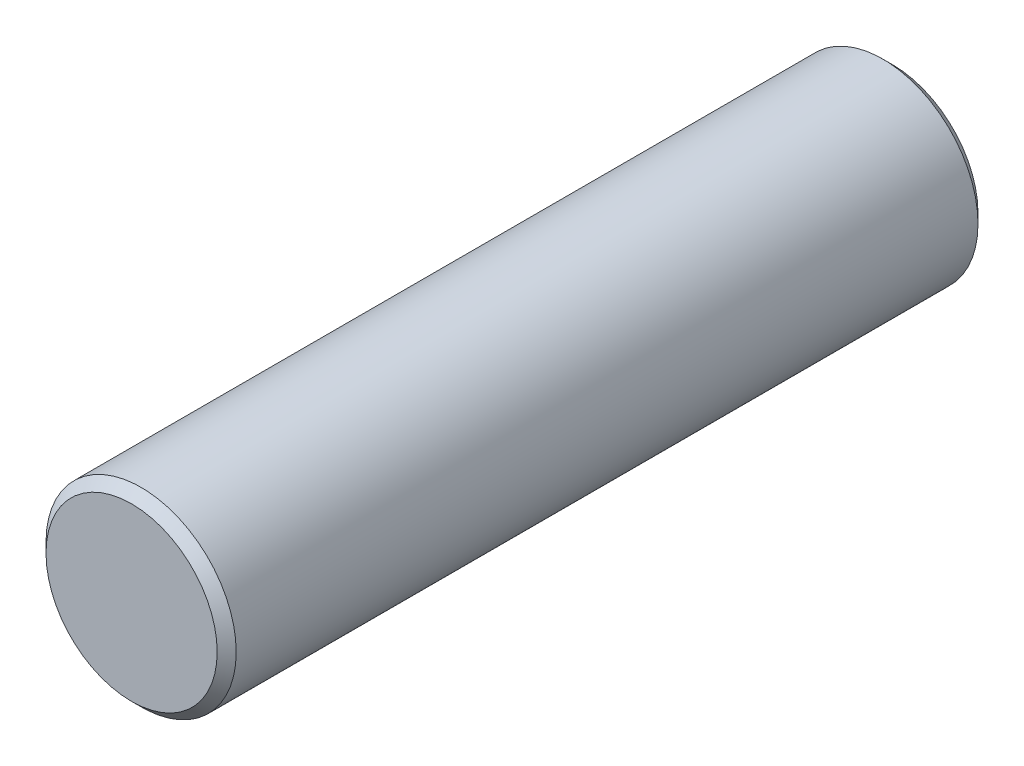
ISO-10303-21;
HEADER;
FILE_DESCRIPTION(('STEP AP214'),'2;1');
FILE_NAME('part.step','',(''),(''),'','','');
FILE_SCHEMA(('AUTOMOTIVE_DESIGN { 1 0 10303 214 1 1 1 1 }'));
ENDSEC;
DATA;
#1=APPLICATION_CONTEXT('core data for automotive mechanical design processes');
#2=APPLICATION_PROTOCOL_DEFINITION('international standard','automotive_design',2000,#1);
#3=PRODUCT_CONTEXT('',#1,'mechanical');
#4=PRODUCT('Part','Part','',(#3));
#5=PRODUCT_RELATED_PRODUCT_CATEGORY('part','',(#4));
#6=PRODUCT_DEFINITION_FORMATION('','',#4);
#7=PRODUCT_DEFINITION_CONTEXT('part definition',#1,'design');
#8=PRODUCT_DEFINITION('design','',#6,#7);
#9=PRODUCT_DEFINITION_SHAPE('','',#8);
#10=(LENGTH_UNIT() NAMED_UNIT(*) SI_UNIT(.MILLI.,.METRE.));
#11=(NAMED_UNIT(*) PLANE_ANGLE_UNIT() SI_UNIT($,.RADIAN.));
#12=(NAMED_UNIT(*) SI_UNIT($,.STERADIAN.) SOLID_ANGLE_UNIT());
#13=UNCERTAINTY_MEASURE_WITH_UNIT(LENGTH_MEASURE(1.E-05),#10,'distance_accuracy_value','');
#14=(GEOMETRIC_REPRESENTATION_CONTEXT(3) GLOBAL_UNCERTAINTY_ASSIGNED_CONTEXT((#13)) GLOBAL_UNIT_ASSIGNED_CONTEXT((#10,
#11,#12)) REPRESENTATION_CONTEXT('',''));
#15=CARTESIAN_POINT('',(0.,0.,0.));
#16=DIRECTION('',(0.,0.,1.));
#17=DIRECTION('',(1.,0.,0.));
#18=AXIS2_PLACEMENT_3D('',#15,#16,#17);
#19=CARTESIAN_POINT('',(0.,0.,40.));
#20=DIRECTION('',(0.,0.,-1.));
#21=DIRECTION('',(-1.00000000000003,0.,0.));
#22=AXIS2_PLACEMENT_3D('',#19,#20,#21);
#23=CYLINDRICAL_SURFACE('',#22,5.);
#24=CARTESIAN_POINT('',(0.,0.,0.500000000000007));
#25=DIRECTION('',(0.,0.,1.));
#26=DIRECTION('',(1.00000000000003,0.,0.));
#27=AXIS2_PLACEMENT_3D('',#24,#25,#26);
#28=CIRCLE('',#27,5.);
#29=CARTESIAN_POINT('',(5.00000000000013,0.,0.500000000000007));
#30=VERTEX_POINT('',#29);
#31=EDGE_CURVE('E27',#30,#30,#28,.T.);
#32=ORIENTED_EDGE('',*,*,#31,.T.);
#33=EDGE_LOOP('',(#32));
#34=FACE_BOUND('',#33,.T.);
#35=CARTESIAN_POINT('',(0.,0.,39.5));
#36=DIRECTION('',(0.,0.,1.));
#37=DIRECTION('',(1.00000000000003,0.,0.));
#38=AXIS2_PLACEMENT_3D('',#35,#36,#37);
#39=CIRCLE('',#38,5.);
#40=CARTESIAN_POINT('',(5.00000000000013,0.,39.5));
#41=VERTEX_POINT('',#40);
#42=EDGE_CURVE('E31',#41,#41,#39,.F.);
#43=ORIENTED_EDGE('',*,*,#42,.T.);
#44=EDGE_LOOP('',(#43));
#45=FACE_BOUND('',#44,.T.);
#46=ADVANCED_FACE('F15',(#34,#45),#23,.T.);
#47=CARTESIAN_POINT('',(0.,0.,40.));
#48=DIRECTION('',(0.,0.,1.));
#49=DIRECTION('',(1.00000000000003,0.,0.));
#50=AXIS2_PLACEMENT_3D('',#47,#48,#49);
#51=PLANE('',#50);
#52=CARTESIAN_POINT('',(0.,0.,40.));
#53=DIRECTION('',(0.,0.,1.));
#54=DIRECTION('',(1.00000000000003,0.,0.));
#55=AXIS2_PLACEMENT_3D('',#52,#53,#54);
#56=CIRCLE('',#55,4.5);
#57=CARTESIAN_POINT('',(4.50000000000012,0.,40.));
#58=VERTEX_POINT('',#57);
#59=EDGE_CURVE('E10',#58,#58,#56,.T.);
#60=ORIENTED_EDGE('',*,*,#59,.T.);
#61=EDGE_LOOP('',(#60));
#62=FACE_BOUND('',#61,.T.);
#63=ADVANCED_FACE('F49',(#62),#51,.T.);
#64=CARTESIAN_POINT('',(0.,0.,0.));
#65=DIRECTION('',(0.,0.,1.));
#66=DIRECTION('',(1.00000000000003,0.,0.));
#67=AXIS2_PLACEMENT_3D('',#64,#65,#66);
#68=PLANE('',#67);
#69=CARTESIAN_POINT('',(0.,0.,0.));
#70=DIRECTION('',(0.,0.,1.));
#71=DIRECTION('',(1.00000000000003,0.,0.));
#72=AXIS2_PLACEMENT_3D('',#69,#70,#71);
#73=CIRCLE('',#72,4.5);
#74=CARTESIAN_POINT('',(4.50000000000012,0.,0.));
#75=VERTEX_POINT('',#74);
#76=EDGE_CURVE('E23',#75,#75,#73,.F.);
#77=ORIENTED_EDGE('',*,*,#76,.T.);
#78=EDGE_LOOP('',(#77));
#79=FACE_BOUND('',#78,.T.);
#80=ADVANCED_FACE('F46',(#79),#68,.F.);
#81=CARTESIAN_POINT('',(0.,0.,0.500000000000007));
#82=DIRECTION('',(0.,0.,1.));
#83=DIRECTION('',(1.00000000000003,0.,0.));
#84=AXIS2_PLACEMENT_3D('',#81,#82,#83);
#85=CONICAL_SURFACE('',#84,5.,0.785398163397455);
#86=ORIENTED_EDGE('',*,*,#76,.F.);
#87=EDGE_LOOP('',(#86));
#88=FACE_BOUND('',#87,.T.);
#89=ORIENTED_EDGE('',*,*,#31,.F.);
#90=EDGE_LOOP('',(#89));
#91=FACE_BOUND('',#90,.T.);
#92=ADVANCED_FACE('F40',(#88,#91),#85,.T.);
#93=CARTESIAN_POINT('',(0.,0.,40.));
#94=DIRECTION('',(0.,0.,-1.));
#95=DIRECTION('',(-1.00000000000003,0.,0.));
#96=AXIS2_PLACEMENT_3D('',#93,#94,#95);
#97=CONICAL_SURFACE('',#96,4.5,0.78539816339745);
#98=ORIENTED_EDGE('',*,*,#42,.F.);
#99=EDGE_LOOP('',(#98));
#100=FACE_BOUND('',#99,.T.);
#101=ORIENTED_EDGE('',*,*,#59,.F.);
#102=EDGE_LOOP('',(#101));
#103=FACE_BOUND('',#102,.T.);
#104=ADVANCED_FACE('F18',(#100,#103),#97,.T.);
#105=CLOSED_SHELL('',(#46,#63,#80,#92,#104));
#106=MANIFOLD_SOLID_BREP('B1',#105);
#107=ADVANCED_BREP_SHAPE_REPRESENTATION('',(#18,#106),#14);
#108=SHAPE_DEFINITION_REPRESENTATION(#9,#107);
ENDSEC;
END-ISO-10303-21;
